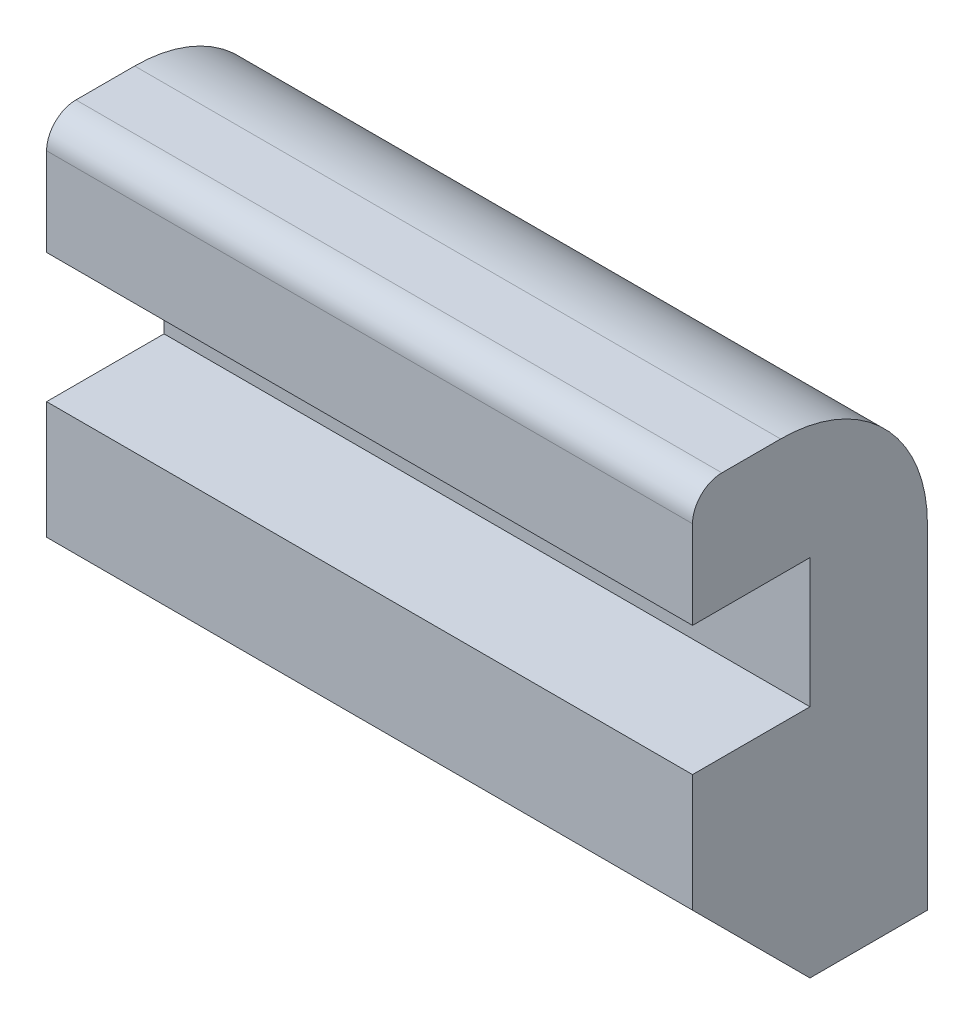
ISO-10303-21;
HEADER;
FILE_DESCRIPTION(('STEP AP214'),'2;1');
FILE_NAME('part.step','',(''),(''),'','','');
FILE_SCHEMA(('AUTOMOTIVE_DESIGN { 1 0 10303 214 1 1 1 1 }'));
ENDSEC;
DATA;
#1=APPLICATION_CONTEXT('core data for automotive mechanical design processes');
#2=APPLICATION_PROTOCOL_DEFINITION('international standard','automotive_design',2000,#1);
#3=PRODUCT_CONTEXT('',#1,'mechanical');
#4=PRODUCT('Part','Part','',(#3));
#5=PRODUCT_RELATED_PRODUCT_CATEGORY('part','',(#4));
#6=PRODUCT_DEFINITION_FORMATION('','',#4);
#7=PRODUCT_DEFINITION_CONTEXT('part definition',#1,'design');
#8=PRODUCT_DEFINITION('design','',#6,#7);
#9=PRODUCT_DEFINITION_SHAPE('','',#8);
#10=(LENGTH_UNIT() NAMED_UNIT(*) SI_UNIT(.MILLI.,.METRE.));
#11=(NAMED_UNIT(*) PLANE_ANGLE_UNIT() SI_UNIT($,.RADIAN.));
#12=(NAMED_UNIT(*) SI_UNIT($,.STERADIAN.) SOLID_ANGLE_UNIT());
#13=UNCERTAINTY_MEASURE_WITH_UNIT(LENGTH_MEASURE(1.E-05),#10,'distance_accuracy_value','');
#14=(GEOMETRIC_REPRESENTATION_CONTEXT(3) GLOBAL_UNCERTAINTY_ASSIGNED_CONTEXT((#13)) GLOBAL_UNIT_ASSIGNED_CONTEXT((#10,
#11,#12)) REPRESENTATION_CONTEXT('',''));
#15=CARTESIAN_POINT('',(0.,0.,0.));
#16=DIRECTION('',(0.,0.,1.));
#17=DIRECTION('',(1.,0.,0.));
#18=AXIS2_PLACEMENT_3D('',#15,#16,#17);
#19=CARTESIAN_POINT('',(-19.5,2.,-77.5));
#20=DIRECTION('',(0.,0.,1.));
#21=DIRECTION('',(1.,0.,0.));
#22=AXIS2_PLACEMENT_3D('',#19,#20,#21);
#23=PLANE('',#22);
#24=DIRECTION('',(0.,1.,0.));
#25=VECTOR('',#24,1.);
#26=CARTESIAN_POINT('',(5.5,0.,-77.5));
#27=LINE('',#26,#25);
#28=CARTESIAN_POINT('',(5.5,31.8,-77.5));
#29=VERTEX_POINT('',#28);
#30=CARTESIAN_POINT('',(5.5,37.5,-77.5));
#31=VERTEX_POINT('',#30);
#32=EDGE_CURVE('E130',#29,#31,#27,.T.);
#33=ORIENTED_EDGE('',*,*,#32,.F.);
#34=DIRECTION('',(-1.,0.,0.));
#35=VECTOR('',#34,1.);
#36=CARTESIAN_POINT('',(0.,31.8,-77.5));
#37=LINE('',#36,#35);
#38=CARTESIAN_POINT('',(-5.5,31.8,-77.5));
#39=VERTEX_POINT('',#38);
#40=EDGE_CURVE('E118',#29,#39,#37,.T.);
#41=ORIENTED_EDGE('',*,*,#40,.T.);
#42=DIRECTION('',(0.,1.,0.));
#43=VECTOR('',#42,1.);
#44=CARTESIAN_POINT('',(-5.5,0.,-77.5));
#45=LINE('',#44,#43);
#46=CARTESIAN_POINT('',(-5.5,37.5,-77.5));
#47=VERTEX_POINT('',#46);
#48=EDGE_CURVE('E140',#39,#47,#45,.T.);
#49=ORIENTED_EDGE('',*,*,#48,.T.);
#50=DIRECTION('',(-1.,0.,0.));
#51=VECTOR('',#50,1.);
#52=CARTESIAN_POINT('',(19.5,37.5,-77.5));
#53=LINE('',#52,#51);
#54=EDGE_CURVE('E137',#47,#31,#53,.F.);
#55=ORIENTED_EDGE('',*,*,#54,.T.);
#56=EDGE_LOOP('',(#33,#41,#49,#55));
#57=FACE_BOUND('',#56,.T.);
#58=ADVANCED_FACE('F37',(#57),#23,.F.);
#59=CARTESIAN_POINT('',(0.,40.,-75.5));
#60=DIRECTION('',(0.,0.,-1.));
#61=DIRECTION('',(-1.,0.,0.));
#62=AXIS2_PLACEMENT_3D('',#59,#60,#61);
#63=PLANE('',#62);
#64=DIRECTION('',(1.,0.,0.));
#65=VECTOR('',#64,1.);
#66=CARTESIAN_POINT('',(-15.5,38.,-75.5));
#67=LINE('',#66,#65);
#68=CARTESIAN_POINT('',(-5.5,38.,-75.5));
#69=VERTEX_POINT('',#68);
#70=CARTESIAN_POINT('',(5.5,38.,-75.5));
#71=VERTEX_POINT('',#70);
#72=EDGE_CURVE('E196',#69,#71,#67,.T.);
#73=ORIENTED_EDGE('',*,*,#72,.F.);
#74=DIRECTION('',(0.,-1.,0.));
#75=VECTOR('',#74,1.);
#76=CARTESIAN_POINT('',(-5.5,40.,-75.5));
#77=LINE('',#76,#75);
#78=CARTESIAN_POINT('',(-5.5,35.8,-75.5));
#79=VERTEX_POINT('',#78);
#80=EDGE_CURVE('E171',#69,#79,#77,.T.);
#81=ORIENTED_EDGE('',*,*,#80,.T.);
#82=DIRECTION('',(-1.,0.,0.));
#83=VECTOR('',#82,1.);
#84=CARTESIAN_POINT('',(-15.5,35.8,-75.5));
#85=LINE('',#84,#83);
#86=CARTESIAN_POINT('',(5.5,35.8,-75.5));
#87=VERTEX_POINT('',#86);
#88=EDGE_CURVE('E193',#87,#79,#85,.T.);
#89=ORIENTED_EDGE('',*,*,#88,.F.);
#90=DIRECTION('',(0.,-1.,0.));
#91=VECTOR('',#90,1.);
#92=CARTESIAN_POINT('',(5.5,40.,-75.5));
#93=LINE('',#92,#91);
#94=EDGE_CURVE('E154',#71,#87,#93,.T.);
#95=ORIENTED_EDGE('',*,*,#94,.F.);
#96=EDGE_LOOP('',(#73,#81,#89,#95));
#97=FACE_BOUND('',#96,.T.);
#98=ADVANCED_FACE('F224',(#97),#63,.F.);
#99=CARTESIAN_POINT('',(0.,40.,0.));
#100=DIRECTION('',(0.,1.,0.));
#101=DIRECTION('',(0.,0.,1.));
#102=AXIS2_PLACEMENT_3D('',#99,#100,#101);
#103=PLANE('',#102);
#104=DIRECTION('',(0.,0.,1.));
#105=VECTOR('',#104,1.);
#106=CARTESIAN_POINT('',(-5.5,40.,-77.5));
#107=LINE('',#106,#105);
#108=CARTESIAN_POINT('',(-5.5,40.,-75.));
#109=VERTEX_POINT('',#108);
#110=CARTESIAN_POINT('',(-5.5,40.,-74.));
#111=VERTEX_POINT('',#110);
#112=EDGE_CURVE('E144',#109,#111,#107,.T.);
#113=ORIENTED_EDGE('',*,*,#112,.T.);
#114=DIRECTION('',(-1.,0.,0.));
#115=VECTOR('',#114,1.);
#116=CARTESIAN_POINT('',(15.5,40.,-74.));
#117=LINE('',#116,#115);
#118=CARTESIAN_POINT('',(5.5,40.,-74.));
#119=VERTEX_POINT('',#118);
#120=EDGE_CURVE('E45',#111,#119,#117,.F.);
#121=ORIENTED_EDGE('',*,*,#120,.T.);
#122=DIRECTION('',(0.,0.,1.));
#123=VECTOR('',#122,1.);
#124=CARTESIAN_POINT('',(5.5,40.,-77.5));
#125=LINE('',#124,#123);
#126=CARTESIAN_POINT('',(5.5,40.,-75.));
#127=VERTEX_POINT('',#126);
#128=EDGE_CURVE('E138',#127,#119,#125,.T.);
#129=ORIENTED_EDGE('',*,*,#128,.F.);
#130=DIRECTION('',(-1.,0.,0.));
#131=VECTOR('',#130,1.);
#132=CARTESIAN_POINT('',(-19.5,40.,-75.));
#133=LINE('',#132,#131);
#134=EDGE_CURVE('E199',#127,#109,#133,.T.);
#135=ORIENTED_EDGE('',*,*,#134,.T.);
#136=EDGE_LOOP('',(#113,#121,#129,#135));
#137=FACE_BOUND('',#136,.T.);
#138=ADVANCED_FACE('F207',(#137),#103,.T.);
#139=CARTESIAN_POINT('',(15.5,35.8,81.9721359549996));
#140=DIRECTION('',(0.,-1.,0.));
#141=DIRECTION('',(0.,0.,-1.));
#142=AXIS2_PLACEMENT_3D('',#139,#140,#141);
#143=PLANE('',#142);
#144=ORIENTED_EDGE('',*,*,#88,.T.);
#145=DIRECTION('',(0.,0.,1.));
#146=VECTOR('',#145,1.);
#147=CARTESIAN_POINT('',(-5.5,35.8,81.9721359549996));
#148=LINE('',#147,#146);
#149=CARTESIAN_POINT('',(-5.5,35.8,-73.5));
#150=VERTEX_POINT('',#149);
#151=EDGE_CURVE('E174',#79,#150,#148,.T.);
#152=ORIENTED_EDGE('',*,*,#151,.T.);
#153=DIRECTION('',(-1.,0.,0.));
#154=VECTOR('',#153,1.);
#155=CARTESIAN_POINT('',(21.9721359549996,35.8,-73.5));
#156=LINE('',#155,#154);
#157=CARTESIAN_POINT('',(5.5,35.8,-73.5));
#158=VERTEX_POINT('',#157);
#159=EDGE_CURVE('E183',#158,#150,#156,.T.);
#160=ORIENTED_EDGE('',*,*,#159,.F.);
#161=DIRECTION('',(0.,0.,1.));
#162=VECTOR('',#161,1.);
#163=CARTESIAN_POINT('',(5.5,35.8,81.9721359549996));
#164=LINE('',#163,#162);
#165=EDGE_CURVE('E156',#87,#158,#164,.T.);
#166=ORIENTED_EDGE('',*,*,#165,.F.);
#167=EDGE_LOOP('',(#144,#152,#160,#166));
#168=FACE_BOUND('',#167,.T.);
#169=ADVANCED_FACE('F226',(#168),#143,.F.);
#170=CARTESIAN_POINT('',(15.5,38.,81.9721359549996));
#171=DIRECTION('',(0.,1.,0.));
#172=DIRECTION('',(0.,0.,1.));
#173=AXIS2_PLACEMENT_3D('',#170,#171,#172);
#174=PLANE('',#173);
#175=DIRECTION('',(-1.,0.,0.));
#176=VECTOR('',#175,1.);
#177=CARTESIAN_POINT('',(21.9721359549996,38.,-73.5));
#178=LINE('',#177,#176);
#179=CARTESIAN_POINT('',(5.5,38.,-73.5));
#180=VERTEX_POINT('',#179);
#181=CARTESIAN_POINT('',(-5.5,38.,-73.5));
#182=VERTEX_POINT('',#181);
#183=EDGE_CURVE('E189',#180,#182,#178,.T.);
#184=ORIENTED_EDGE('',*,*,#183,.T.);
#185=DIRECTION('',(0.,0.,-1.));
#186=VECTOR('',#185,1.);
#187=CARTESIAN_POINT('',(-5.5,38.,81.9721359549996));
#188=LINE('',#187,#186);
#189=EDGE_CURVE('E168',#182,#69,#188,.T.);
#190=ORIENTED_EDGE('',*,*,#189,.T.);
#191=ORIENTED_EDGE('',*,*,#72,.T.);
#192=DIRECTION('',(0.,0.,-1.));
#193=VECTOR('',#192,1.);
#194=CARTESIAN_POINT('',(5.5,38.,81.9721359549996));
#195=LINE('',#194,#193);
#196=EDGE_CURVE('E152',#180,#71,#195,.T.);
#197=ORIENTED_EDGE('',*,*,#196,.F.);
#198=EDGE_LOOP('',(#184,#190,#191,#197));
#199=FACE_BOUND('',#198,.T.);
#200=ADVANCED_FACE('F218',(#199),#174,.F.);
#201=CARTESIAN_POINT('',(21.9721359549996,40.,-73.5));
#202=DIRECTION('',(0.,0.,-1.));
#203=DIRECTION('',(0.,1.,0.));
#204=AXIS2_PLACEMENT_3D('',#201,#202,#203);
#205=PLANE('',#204);
#206=DIRECTION('',(-1.,0.,0.));
#207=VECTOR('',#206,1.);
#208=CARTESIAN_POINT('',(-15.5,39.5,-73.5));
#209=LINE('',#208,#207);
#210=CARTESIAN_POINT('',(5.5,39.5,-73.5));
#211=VERTEX_POINT('',#210);
#212=CARTESIAN_POINT('',(-5.5,39.5,-73.5));
#213=VERTEX_POINT('',#212);
#214=EDGE_CURVE('E11',#211,#213,#209,.T.);
#215=ORIENTED_EDGE('',*,*,#214,.T.);
#216=DIRECTION('',(0.,-1.,0.));
#217=VECTOR('',#216,1.);
#218=CARTESIAN_POINT('',(-5.5,40.,-73.5));
#219=LINE('',#218,#217);
#220=EDGE_CURVE('E165',#213,#182,#219,.T.);
#221=ORIENTED_EDGE('',*,*,#220,.T.);
#222=ORIENTED_EDGE('',*,*,#183,.F.);
#223=DIRECTION('',(0.,-1.,0.));
#224=VECTOR('',#223,1.);
#225=CARTESIAN_POINT('',(5.5,40.,-73.5));
#226=LINE('',#225,#224);
#227=EDGE_CURVE('E150',#211,#180,#226,.T.);
#228=ORIENTED_EDGE('',*,*,#227,.F.);
#229=EDGE_LOOP('',(#215,#221,#222,#228));
#230=FACE_BOUND('',#229,.T.);
#231=ADVANCED_FACE('F216',(#230),#205,.F.);
#232=CARTESIAN_POINT('',(21.9721359549996,35.8,-73.5));
#233=DIRECTION('',(0.,0.,-1.));
#234=DIRECTION('',(0.,1.,0.));
#235=AXIS2_PLACEMENT_3D('',#232,#233,#234);
#236=PLANE('',#235);
#237=ORIENTED_EDGE('',*,*,#159,.T.);
#238=DIRECTION('',(0.,-1.,0.));
#239=VECTOR('',#238,1.);
#240=CARTESIAN_POINT('',(-5.5,35.8,-73.5));
#241=LINE('',#240,#239);
#242=CARTESIAN_POINT('',(-5.5,33.8,-73.5));
#243=VERTEX_POINT('',#242);
#244=EDGE_CURVE('E177',#150,#243,#241,.T.);
#245=ORIENTED_EDGE('',*,*,#244,.T.);
#246=DIRECTION('',(-1.,0.,0.));
#247=VECTOR('',#246,1.);
#248=CARTESIAN_POINT('',(21.9721359549996,33.8,-73.5));
#249=LINE('',#248,#247);
#250=CARTESIAN_POINT('',(5.5,33.8,-73.5));
#251=VERTEX_POINT('',#250);
#252=EDGE_CURVE('E186',#251,#243,#249,.T.);
#253=ORIENTED_EDGE('',*,*,#252,.F.);
#254=DIRECTION('',(0.,-1.,0.));
#255=VECTOR('',#254,1.);
#256=CARTESIAN_POINT('',(5.5,35.8,-73.5));
#257=LINE('',#256,#255);
#258=EDGE_CURVE('E158',#158,#251,#257,.T.);
#259=ORIENTED_EDGE('',*,*,#258,.F.);
#260=EDGE_LOOP('',(#237,#245,#253,#259));
#261=FACE_BOUND('',#260,.T.);
#262=ADVANCED_FACE('F231',(#261),#236,.F.);
#263=CARTESIAN_POINT('',(21.9721359549996,33.8,-73.5));
#264=DIRECTION('',(0.,0.707106781186546,-0.707106781186549));
#265=DIRECTION('',(0.,0.707106781186549,0.707106781186546));
#266=AXIS2_PLACEMENT_3D('',#263,#264,#265);
#267=PLANE('',#266);
#268=ORIENTED_EDGE('',*,*,#252,.T.);
#269=DIRECTION('',(0.,-0.707106781186549,-0.707106781186546));
#270=VECTOR('',#269,1.);
#271=CARTESIAN_POINT('',(-5.5,33.8,-73.5));
#272=LINE('',#271,#270);
#273=CARTESIAN_POINT('',(-5.5,31.8,-75.5));
#274=VERTEX_POINT('',#273);
#275=EDGE_CURVE('E59',#243,#274,#272,.T.);
#276=ORIENTED_EDGE('',*,*,#275,.T.);
#277=DIRECTION('',(-1.,0.,0.));
#278=VECTOR('',#277,1.);
#279=CARTESIAN_POINT('',(21.9721359549996,31.8,-75.5));
#280=LINE('',#279,#278);
#281=CARTESIAN_POINT('',(5.5,31.8,-75.5));
#282=VERTEX_POINT('',#281);
#283=EDGE_CURVE('E52',#282,#274,#280,.T.);
#284=ORIENTED_EDGE('',*,*,#283,.F.);
#285=DIRECTION('',(0.,-0.707106781186549,-0.707106781186546));
#286=VECTOR('',#285,1.);
#287=CARTESIAN_POINT('',(5.5,33.8,-73.5));
#288=LINE('',#287,#286);
#289=EDGE_CURVE('E133',#251,#282,#288,.T.);
#290=ORIENTED_EDGE('',*,*,#289,.F.);
#291=EDGE_LOOP('',(#268,#276,#284,#290));
#292=FACE_BOUND('',#291,.T.);
#293=ADVANCED_FACE('F233',(#292),#267,.F.);
#294=CARTESIAN_POINT('',(0.,37.5,-75.));
#295=DIRECTION('',(1.,0.,0.));
#296=DIRECTION('',(0.,0.,-1.));
#297=AXIS2_PLACEMENT_3D('',#294,#295,#296);
#298=CYLINDRICAL_SURFACE('',#297,2.5);
#299=CARTESIAN_POINT('',(-5.5,37.5,-75.));
#300=DIRECTION('',(1.,0.,0.));
#301=DIRECTION('',(0.,0.,-1.));
#302=AXIS2_PLACEMENT_3D('',#299,#300,#301);
#303=CIRCLE('',#302,2.5);
#304=EDGE_CURVE('E180',#109,#47,#303,.F.);
#305=ORIENTED_EDGE('',*,*,#304,.F.);
#306=ORIENTED_EDGE('',*,*,#134,.F.);
#307=CARTESIAN_POINT('',(5.5,37.5,-75.));
#308=DIRECTION('',(1.,0.,0.));
#309=DIRECTION('',(0.,0.,-1.));
#310=AXIS2_PLACEMENT_3D('',#307,#308,#309);
#311=CIRCLE('',#310,2.5);
#312=EDGE_CURVE('E161',#127,#31,#311,.F.);
#313=ORIENTED_EDGE('',*,*,#312,.T.);
#314=ORIENTED_EDGE('',*,*,#54,.F.);
#315=EDGE_LOOP('',(#305,#306,#313,#314));
#316=FACE_BOUND('',#315,.T.);
#317=ADVANCED_FACE('F235',(#316),#298,.T.);
#318=CARTESIAN_POINT('',(21.9721359549996,39.5,-74.));
#319=DIRECTION('',(1.,0.,0.));
#320=DIRECTION('',(0.,0.,-1.));
#321=AXIS2_PLACEMENT_3D('',#318,#319,#320);
#322=CYLINDRICAL_SURFACE('',#321,0.5);
#323=CARTESIAN_POINT('',(-5.5,39.5,-74.));
#324=DIRECTION('',(1.,0.,0.));
#325=DIRECTION('',(0.,0.,-1.));
#326=AXIS2_PLACEMENT_3D('',#323,#324,#325);
#327=CIRCLE('',#326,0.5);
#328=EDGE_CURVE('E163',#213,#111,#327,.F.);
#329=ORIENTED_EDGE('',*,*,#328,.F.);
#330=ORIENTED_EDGE('',*,*,#214,.F.);
#331=CARTESIAN_POINT('',(5.5,39.5,-74.));
#332=DIRECTION('',(1.,0.,0.));
#333=DIRECTION('',(0.,0.,-1.));
#334=AXIS2_PLACEMENT_3D('',#331,#332,#333);
#335=CIRCLE('',#334,0.5);
#336=EDGE_CURVE('E147',#211,#119,#335,.F.);
#337=ORIENTED_EDGE('',*,*,#336,.T.);
#338=ORIENTED_EDGE('',*,*,#120,.F.);
#339=EDGE_LOOP('',(#329,#330,#337,#338));
#340=FACE_BOUND('',#339,.T.);
#341=ADVANCED_FACE('F39',(#340),#322,.T.);
#342=CARTESIAN_POINT('',(5.5,0.,-77.5));
#343=DIRECTION('',(1.,0.,0.));
#344=DIRECTION('',(0.,0.,-1.));
#345=AXIS2_PLACEMENT_3D('',#342,#343,#344);
#346=PLANE('',#345);
#347=DIRECTION('',(0.,0.,1.));
#348=VECTOR('',#347,1.);
#349=CARTESIAN_POINT('',(5.5,31.8,-77.5));
#350=LINE('',#349,#348);
#351=EDGE_CURVE('E121',#29,#282,#350,.T.);
#352=ORIENTED_EDGE('',*,*,#351,.F.);
#353=ORIENTED_EDGE('',*,*,#32,.T.);
#354=ORIENTED_EDGE('',*,*,#312,.F.);
#355=ORIENTED_EDGE('',*,*,#128,.T.);
#356=ORIENTED_EDGE('',*,*,#336,.F.);
#357=ORIENTED_EDGE('',*,*,#227,.T.);
#358=ORIENTED_EDGE('',*,*,#196,.T.);
#359=ORIENTED_EDGE('',*,*,#94,.T.);
#360=ORIENTED_EDGE('',*,*,#165,.T.);
#361=ORIENTED_EDGE('',*,*,#258,.T.);
#362=ORIENTED_EDGE('',*,*,#289,.T.);
#363=EDGE_LOOP('',(#352,#353,#354,#355,#356,#357,#358,#359,#360,#361,#362));
#364=FACE_BOUND('',#363,.T.);
#365=ADVANCED_FACE('F129',(#364),#346,.T.);
#366=CARTESIAN_POINT('',(-5.5,0.,-77.5));
#367=DIRECTION('',(1.,0.,0.));
#368=DIRECTION('',(0.,0.,-1.));
#369=AXIS2_PLACEMENT_3D('',#366,#367,#368);
#370=PLANE('',#369);
#371=ORIENTED_EDGE('',*,*,#48,.F.);
#372=DIRECTION('',(0.,0.,1.));
#373=VECTOR('',#372,1.);
#374=CARTESIAN_POINT('',(-5.5,31.8,-77.5));
#375=LINE('',#374,#373);
#376=EDGE_CURVE('E123',#39,#274,#375,.T.);
#377=ORIENTED_EDGE('',*,*,#376,.T.);
#378=ORIENTED_EDGE('',*,*,#275,.F.);
#379=ORIENTED_EDGE('',*,*,#244,.F.);
#380=ORIENTED_EDGE('',*,*,#151,.F.);
#381=ORIENTED_EDGE('',*,*,#80,.F.);
#382=ORIENTED_EDGE('',*,*,#189,.F.);
#383=ORIENTED_EDGE('',*,*,#220,.F.);
#384=ORIENTED_EDGE('',*,*,#328,.T.);
#385=ORIENTED_EDGE('',*,*,#112,.F.);
#386=ORIENTED_EDGE('',*,*,#304,.T.);
#387=EDGE_LOOP('',(#371,#377,#378,#379,#380,#381,#382,#383,#384,#385,#386));
#388=FACE_BOUND('',#387,.T.);
#389=ADVANCED_FACE('F291',(#388),#370,.F.);
#390=CARTESIAN_POINT('',(0.,31.8,-77.5));
#391=DIRECTION('',(0.,1.,0.));
#392=DIRECTION('',(0.,0.,1.));
#393=AXIS2_PLACEMENT_3D('',#390,#391,#392);
#394=PLANE('',#393);
#395=ORIENTED_EDGE('',*,*,#283,.T.);
#396=ORIENTED_EDGE('',*,*,#376,.F.);
#397=ORIENTED_EDGE('',*,*,#40,.F.);
#398=ORIENTED_EDGE('',*,*,#351,.T.);
#399=EDGE_LOOP('',(#395,#396,#397,#398));
#400=FACE_BOUND('',#399,.T.);
#401=ADVANCED_FACE('F120',(#400),#394,.F.);
#402=CLOSED_SHELL('',(#58,#98,#138,#169,#200,#231,#262,#293,#317,#341,#365,#389,#401));
#403=MANIFOLD_SOLID_BREP('B2',#402);
#404=ADVANCED_BREP_SHAPE_REPRESENTATION('',(#18,#403),#14);
#405=SHAPE_DEFINITION_REPRESENTATION(#9,#404);
ENDSEC;
END-ISO-10303-21;
